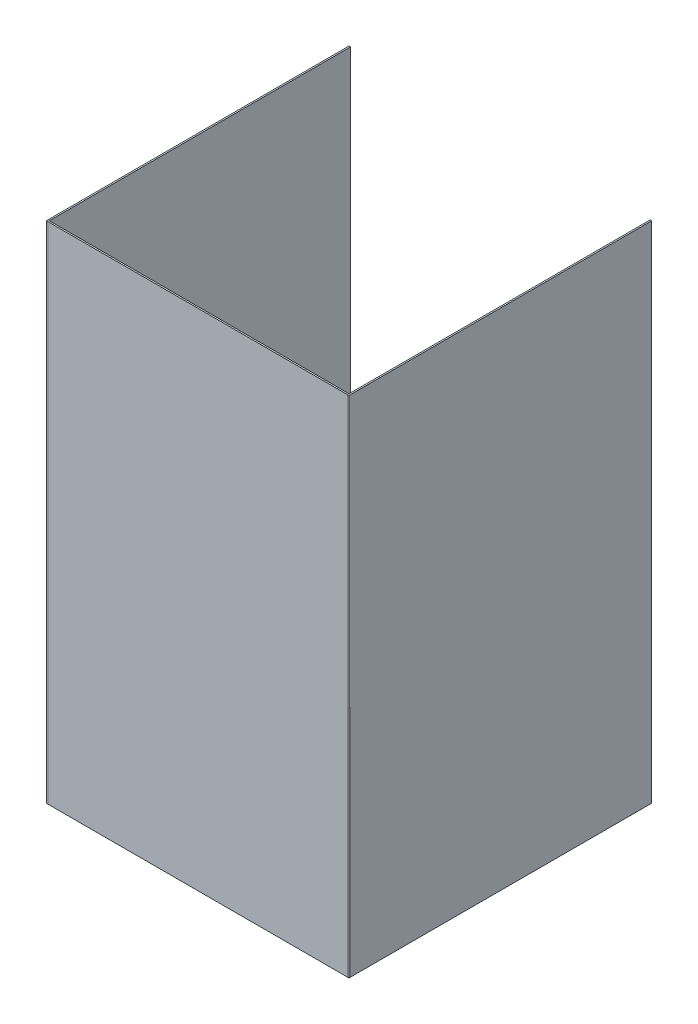
ISO-10303-21;
HEADER;
FILE_DESCRIPTION(('STEP AP214'),'2;1');
FILE_NAME('part.step','',(''),(''),'','','');
FILE_SCHEMA(('AUTOMOTIVE_DESIGN { 1 0 10303 214 1 1 1 1 }'));
ENDSEC;
DATA;
#1=APPLICATION_CONTEXT('core data for automotive mechanical design processes');
#2=APPLICATION_PROTOCOL_DEFINITION('international standard','automotive_design',2000,#1);
#3=PRODUCT_CONTEXT('',#1,'mechanical');
#4=PRODUCT('Part','Part','',(#3));
#5=PRODUCT_RELATED_PRODUCT_CATEGORY('part','',(#4));
#6=PRODUCT_DEFINITION_FORMATION('','',#4);
#7=PRODUCT_DEFINITION_CONTEXT('part definition',#1,'design');
#8=PRODUCT_DEFINITION('design','',#6,#7);
#9=PRODUCT_DEFINITION_SHAPE('','',#8);
#10=(LENGTH_UNIT() NAMED_UNIT(*) SI_UNIT(.MILLI.,.METRE.));
#11=(NAMED_UNIT(*) PLANE_ANGLE_UNIT() SI_UNIT($,.RADIAN.));
#12=(NAMED_UNIT(*) SI_UNIT($,.STERADIAN.) SOLID_ANGLE_UNIT());
#13=UNCERTAINTY_MEASURE_WITH_UNIT(LENGTH_MEASURE(1.E-05),#10,'distance_accuracy_value','');
#14=(GEOMETRIC_REPRESENTATION_CONTEXT(3) GLOBAL_UNCERTAINTY_ASSIGNED_CONTEXT((#13)) GLOBAL_UNIT_ASSIGNED_CONTEXT((#10,
#11,#12)) REPRESENTATION_CONTEXT('',''));
#15=CARTESIAN_POINT('',(0.,0.,0.));
#16=DIRECTION('',(0.,0.,1.));
#17=DIRECTION('',(1.,0.,0.));
#18=AXIS2_PLACEMENT_3D('',#15,#16,#17);
#19=CARTESIAN_POINT('',(-150.,-248.5,0.));
#20=DIRECTION('',(-1.,0.,0.));
#21=DIRECTION('',(0.,-1.,0.));
#22=AXIS2_PLACEMENT_3D('',#19,#20,#21);
#23=PLANE('',#22);
#24=DIRECTION('',(0.,0.,-1.));
#25=VECTOR('',#24,1.);
#26=CARTESIAN_POINT('',(-150.,-250.,0.));
#27=LINE('',#26,#25);
#28=CARTESIAN_POINT('',(-150.,-250.,0.));
#29=VERTEX_POINT('',#28);
#30=CARTESIAN_POINT('',(-150.,-250.,-300.));
#31=VERTEX_POINT('',#30);
#32=EDGE_CURVE('E118',#29,#31,#27,.T.);
#33=ORIENTED_EDGE('',*,*,#32,.F.);
#34=DIRECTION('',(0.,-1.,0.));
#35=VECTOR('',#34,1.);
#36=CARTESIAN_POINT('',(-150.,-248.5,0.));
#37=LINE('',#36,#35);
#38=CARTESIAN_POINT('',(-150.,-248.5,0.));
#39=VERTEX_POINT('',#38);
#40=EDGE_CURVE('E12',#39,#29,#37,.T.);
#41=ORIENTED_EDGE('',*,*,#40,.F.);
#42=DIRECTION('',(0.,0.,-1.));
#43=VECTOR('',#42,1.);
#44=CARTESIAN_POINT('',(-150.,-248.5,0.));
#45=LINE('',#44,#43);
#46=CARTESIAN_POINT('',(-150.,-248.5,-300.));
#47=VERTEX_POINT('',#46);
#48=EDGE_CURVE('E112',#39,#47,#45,.T.);
#49=ORIENTED_EDGE('',*,*,#48,.T.);
#50=DIRECTION('',(0.,-1.,0.));
#51=VECTOR('',#50,1.);
#52=CARTESIAN_POINT('',(-150.,-248.5,-300.));
#53=LINE('',#52,#51);
#54=EDGE_CURVE('E57',#47,#31,#53,.T.);
#55=ORIENTED_EDGE('',*,*,#54,.T.);
#56=EDGE_LOOP('',(#33,#41,#49,#55));
#57=FACE_BOUND('',#56,.T.);
#58=ADVANCED_FACE('F54',(#57),#23,.T.);
#59=CARTESIAN_POINT('',(-150.,-248.5,0.));
#60=DIRECTION('',(0.,0.,1.));
#61=DIRECTION('',(1.,0.,0.));
#62=AXIS2_PLACEMENT_3D('',#59,#60,#61);
#63=PLANE('',#62);
#64=DIRECTION('',(-1.,0.,0.));
#65=VECTOR('',#64,1.);
#66=CARTESIAN_POINT('',(-150.,-250.,0.));
#67=LINE('',#66,#65);
#68=CARTESIAN_POINT('',(150.,-250.,0.));
#69=VERTEX_POINT('',#68);
#70=EDGE_CURVE('E114',#69,#29,#67,.T.);
#71=ORIENTED_EDGE('',*,*,#70,.F.);
#72=DIRECTION('',(0.,-1.,0.));
#73=VECTOR('',#72,1.);
#74=CARTESIAN_POINT('',(150.,-248.5,0.));
#75=LINE('',#74,#73);
#76=CARTESIAN_POINT('',(150.,-248.5,0.));
#77=VERTEX_POINT('',#76);
#78=EDGE_CURVE('E63',#77,#69,#75,.T.);
#79=ORIENTED_EDGE('',*,*,#78,.F.);
#80=DIRECTION('',(-1.,0.,0.));
#81=VECTOR('',#80,1.);
#82=CARTESIAN_POINT('',(-150.,-248.5,0.));
#83=LINE('',#82,#81);
#84=EDGE_CURVE('E109',#77,#39,#83,.T.);
#85=ORIENTED_EDGE('',*,*,#84,.T.);
#86=ORIENTED_EDGE('',*,*,#40,.T.);
#87=EDGE_LOOP('',(#71,#79,#85,#86));
#88=FACE_BOUND('',#87,.T.);
#89=ADVANCED_FACE('F128',(#88),#63,.T.);
#90=CARTESIAN_POINT('',(150.,-248.5,0.));
#91=DIRECTION('',(1.,0.,0.));
#92=DIRECTION('',(0.,1.,0.));
#93=AXIS2_PLACEMENT_3D('',#90,#91,#92);
#94=PLANE('',#93);
#95=DIRECTION('',(0.,0.,1.));
#96=VECTOR('',#95,1.);
#97=CARTESIAN_POINT('',(150.,-250.,0.));
#98=LINE('',#97,#96);
#99=CARTESIAN_POINT('',(150.,-250.,-300.));
#100=VERTEX_POINT('',#99);
#101=EDGE_CURVE('E104',#100,#69,#98,.T.);
#102=ORIENTED_EDGE('',*,*,#101,.F.);
#103=DIRECTION('',(0.,-1.,0.));
#104=VECTOR('',#103,1.);
#105=CARTESIAN_POINT('',(150.,-248.5,-300.));
#106=LINE('',#105,#104);
#107=CARTESIAN_POINT('',(150.,-248.5,-300.));
#108=VERTEX_POINT('',#107);
#109=EDGE_CURVE('E99',#108,#100,#106,.T.);
#110=ORIENTED_EDGE('',*,*,#109,.F.);
#111=DIRECTION('',(0.,0.,1.));
#112=VECTOR('',#111,1.);
#113=CARTESIAN_POINT('',(150.,-248.5,0.));
#114=LINE('',#113,#112);
#115=EDGE_CURVE('E102',#108,#77,#114,.T.);
#116=ORIENTED_EDGE('',*,*,#115,.T.);
#117=ORIENTED_EDGE('',*,*,#78,.T.);
#118=EDGE_LOOP('',(#102,#110,#116,#117));
#119=FACE_BOUND('',#118,.T.);
#120=ADVANCED_FACE('F101',(#119),#94,.T.);
#121=CARTESIAN_POINT('',(-150.,-248.5,-300.));
#122=DIRECTION('',(0.,0.,-1.));
#123=DIRECTION('',(-1.,0.,0.));
#124=AXIS2_PLACEMENT_3D('',#121,#122,#123);
#125=PLANE('',#124);
#126=DIRECTION('',(1.,0.,0.));
#127=VECTOR('',#126,1.);
#128=CARTESIAN_POINT('',(-150.,-250.,-300.));
#129=LINE('',#128,#127);
#130=EDGE_CURVE('E121',#31,#100,#129,.T.);
#131=ORIENTED_EDGE('',*,*,#130,.F.);
#132=ORIENTED_EDGE('',*,*,#54,.F.);
#133=DIRECTION('',(1.,0.,0.));
#134=VECTOR('',#133,1.);
#135=CARTESIAN_POINT('',(-150.,-248.5,-300.));
#136=LINE('',#135,#134);
#137=EDGE_CURVE('E108',#47,#108,#136,.T.);
#138=ORIENTED_EDGE('',*,*,#137,.T.);
#139=ORIENTED_EDGE('',*,*,#109,.T.);
#140=EDGE_LOOP('',(#131,#132,#138,#139));
#141=FACE_BOUND('',#140,.T.);
#142=ADVANCED_FACE('F111',(#141),#125,.T.);
#143=CARTESIAN_POINT('',(0.,-248.5,0.));
#144=DIRECTION('',(0.,-1.,0.));
#145=DIRECTION('',(1.,0.,0.));
#146=AXIS2_PLACEMENT_3D('',#143,#144,#145);
#147=PLANE('',#146);
#148=ORIENTED_EDGE('',*,*,#48,.F.);
#149=ORIENTED_EDGE('',*,*,#84,.F.);
#150=ORIENTED_EDGE('',*,*,#115,.F.);
#151=ORIENTED_EDGE('',*,*,#137,.F.);
#152=EDGE_LOOP('',(#148,#149,#150,#151));
#153=FACE_BOUND('',#152,.T.);
#154=ADVANCED_FACE('F107',(#153),#147,.F.);
#155=CARTESIAN_POINT('',(0.,-250.,0.));
#156=DIRECTION('',(0.,-1.,0.));
#157=DIRECTION('',(1.,0.,0.));
#158=AXIS2_PLACEMENT_3D('',#155,#156,#157);
#159=PLANE('',#158);
#160=ORIENTED_EDGE('',*,*,#32,.T.);
#161=ORIENTED_EDGE('',*,*,#130,.T.);
#162=ORIENTED_EDGE('',*,*,#101,.T.);
#163=ORIENTED_EDGE('',*,*,#70,.T.);
#164=EDGE_LOOP('',(#160,#161,#162,#163));
#165=FACE_BOUND('',#164,.T.);
#166=ADVANCED_FACE('F127',(#165),#159,.T.);
#167=CLOSED_SHELL('',(#58,#89,#120,#142,#154,#166));
#168=MANIFOLD_SOLID_BREP('B2',#167);
#169=CARTESIAN_POINT('',(-148.5,250.,0.));
#170=DIRECTION('',(0.,0.,1.));
#171=DIRECTION('',(0.,-1.,0.));
#172=AXIS2_PLACEMENT_3D('',#169,#170,#171);
#173=PLANE('',#172);
#174=DIRECTION('',(0.,1.,0.));
#175=VECTOR('',#174,1.);
#176=CARTESIAN_POINT('',(-150.,250.,0.));
#177=LINE('',#176,#175);
#178=CARTESIAN_POINT('',(-150.,-250.,0.));
#179=VERTEX_POINT('',#178);
#180=CARTESIAN_POINT('',(-150.,250.,0.));
#181=VERTEX_POINT('',#180);
#182=EDGE_CURVE('E264',#179,#181,#177,.T.);
#183=ORIENTED_EDGE('',*,*,#182,.F.);
#184=DIRECTION('',(-1.,0.,0.));
#185=VECTOR('',#184,1.);
#186=CARTESIAN_POINT('',(-148.5,-250.,0.));
#187=LINE('',#186,#185);
#188=CARTESIAN_POINT('',(-148.5,-250.,0.));
#189=VERTEX_POINT('',#188);
#190=EDGE_CURVE('E52',#189,#179,#187,.T.);
#191=ORIENTED_EDGE('',*,*,#190,.F.);
#192=DIRECTION('',(0.,1.,0.));
#193=VECTOR('',#192,1.);
#194=CARTESIAN_POINT('',(-148.5,250.,0.));
#195=LINE('',#194,#193);
#196=CARTESIAN_POINT('',(-148.5,250.,0.));
#197=VERTEX_POINT('',#196);
#198=EDGE_CURVE('E258',#189,#197,#195,.T.);
#199=ORIENTED_EDGE('',*,*,#198,.T.);
#200=DIRECTION('',(-1.,0.,0.));
#201=VECTOR('',#200,1.);
#202=CARTESIAN_POINT('',(-148.5,250.,0.));
#203=LINE('',#202,#201);
#204=EDGE_CURVE('E203',#197,#181,#203,.T.);
#205=ORIENTED_EDGE('',*,*,#204,.T.);
#206=EDGE_LOOP('',(#183,#191,#199,#205));
#207=FACE_BOUND('',#206,.T.);
#208=ADVANCED_FACE('F200',(#207),#173,.T.);
#209=CARTESIAN_POINT('',(-148.5,-250.,0.));
#210=DIRECTION('',(0.,-1.,0.));
#211=DIRECTION('',(0.,0.,-1.));
#212=AXIS2_PLACEMENT_3D('',#209,#210,#211);
#213=PLANE('',#212);
#214=DIRECTION('',(0.,0.,1.));
#215=VECTOR('',#214,1.);
#216=CARTESIAN_POINT('',(-150.,-250.,0.));
#217=LINE('',#216,#215);
#218=CARTESIAN_POINT('',(-150.,-250.,-300.));
#219=VERTEX_POINT('',#218);
#220=EDGE_CURVE('E260',#219,#179,#217,.T.);
#221=ORIENTED_EDGE('',*,*,#220,.F.);
#222=DIRECTION('',(-1.,0.,0.));
#223=VECTOR('',#222,1.);
#224=CARTESIAN_POINT('',(-148.5,-250.,-300.));
#225=LINE('',#224,#223);
#226=CARTESIAN_POINT('',(-148.5,-250.,-300.));
#227=VERTEX_POINT('',#226);
#228=EDGE_CURVE('E209',#227,#219,#225,.T.);
#229=ORIENTED_EDGE('',*,*,#228,.F.);
#230=DIRECTION('',(0.,0.,1.));
#231=VECTOR('',#230,1.);
#232=CARTESIAN_POINT('',(-148.5,-250.,0.));
#233=LINE('',#232,#231);
#234=EDGE_CURVE('E255',#227,#189,#233,.T.);
#235=ORIENTED_EDGE('',*,*,#234,.T.);
#236=ORIENTED_EDGE('',*,*,#190,.T.);
#237=EDGE_LOOP('',(#221,#229,#235,#236));
#238=FACE_BOUND('',#237,.T.);
#239=ADVANCED_FACE('F274',(#238),#213,.T.);
#240=CARTESIAN_POINT('',(-148.5,250.,-300.));
#241=DIRECTION('',(0.,0.,-1.));
#242=DIRECTION('',(0.,1.,0.));
#243=AXIS2_PLACEMENT_3D('',#240,#241,#242);
#244=PLANE('',#243);
#245=DIRECTION('',(0.,-1.,0.));
#246=VECTOR('',#245,1.);
#247=CARTESIAN_POINT('',(-150.,250.,-300.));
#248=LINE('',#247,#246);
#249=CARTESIAN_POINT('',(-150.,250.,-300.));
#250=VERTEX_POINT('',#249);
#251=EDGE_CURVE('E250',#250,#219,#248,.T.);
#252=ORIENTED_EDGE('',*,*,#251,.F.);
#253=DIRECTION('',(-1.,0.,0.));
#254=VECTOR('',#253,1.);
#255=CARTESIAN_POINT('',(-148.5,250.,-300.));
#256=LINE('',#255,#254);
#257=CARTESIAN_POINT('',(-148.5,250.,-300.));
#258=VERTEX_POINT('',#257);
#259=EDGE_CURVE('E245',#258,#250,#256,.T.);
#260=ORIENTED_EDGE('',*,*,#259,.F.);
#261=DIRECTION('',(0.,-1.,0.));
#262=VECTOR('',#261,1.);
#263=CARTESIAN_POINT('',(-148.5,250.,-300.));
#264=LINE('',#263,#262);
#265=EDGE_CURVE('E248',#258,#227,#264,.T.);
#266=ORIENTED_EDGE('',*,*,#265,.T.);
#267=ORIENTED_EDGE('',*,*,#228,.T.);
#268=EDGE_LOOP('',(#252,#260,#266,#267));
#269=FACE_BOUND('',#268,.T.);
#270=ADVANCED_FACE('F247',(#269),#244,.T.);
#271=CARTESIAN_POINT('',(-148.5,250.,0.));
#272=DIRECTION('',(0.,1.,0.));
#273=DIRECTION('',(-1.,0.,0.));
#274=AXIS2_PLACEMENT_3D('',#271,#272,#273);
#275=PLANE('',#274);
#276=DIRECTION('',(0.,0.,-1.));
#277=VECTOR('',#276,1.);
#278=CARTESIAN_POINT('',(-150.,250.,0.));
#279=LINE('',#278,#277);
#280=EDGE_CURVE('E267',#181,#250,#279,.T.);
#281=ORIENTED_EDGE('',*,*,#280,.F.);
#282=ORIENTED_EDGE('',*,*,#204,.F.);
#283=DIRECTION('',(0.,0.,-1.));
#284=VECTOR('',#283,1.);
#285=CARTESIAN_POINT('',(-148.5,250.,0.));
#286=LINE('',#285,#284);
#287=EDGE_CURVE('E254',#197,#258,#286,.T.);
#288=ORIENTED_EDGE('',*,*,#287,.T.);
#289=ORIENTED_EDGE('',*,*,#259,.T.);
#290=EDGE_LOOP('',(#281,#282,#288,#289));
#291=FACE_BOUND('',#290,.T.);
#292=ADVANCED_FACE('F257',(#291),#275,.T.);
#293=CARTESIAN_POINT('',(-148.5,0.,0.));
#294=DIRECTION('',(1.,0.,0.));
#295=DIRECTION('',(0.,1.,0.));
#296=AXIS2_PLACEMENT_3D('',#293,#294,#295);
#297=PLANE('',#296);
#298=ORIENTED_EDGE('',*,*,#198,.F.);
#299=ORIENTED_EDGE('',*,*,#234,.F.);
#300=ORIENTED_EDGE('',*,*,#265,.F.);
#301=ORIENTED_EDGE('',*,*,#287,.F.);
#302=EDGE_LOOP('',(#298,#299,#300,#301));
#303=FACE_BOUND('',#302,.T.);
#304=ADVANCED_FACE('F253',(#303),#297,.T.);
#305=CARTESIAN_POINT('',(-150.,0.,0.));
#306=DIRECTION('',(1.,0.,0.));
#307=DIRECTION('',(0.,1.,0.));
#308=AXIS2_PLACEMENT_3D('',#305,#306,#307);
#309=PLANE('',#308);
#310=ORIENTED_EDGE('',*,*,#182,.T.);
#311=ORIENTED_EDGE('',*,*,#280,.T.);
#312=ORIENTED_EDGE('',*,*,#251,.T.);
#313=ORIENTED_EDGE('',*,*,#220,.T.);
#314=EDGE_LOOP('',(#310,#311,#312,#313));
#315=FACE_BOUND('',#314,.T.);
#316=ADVANCED_FACE('F273',(#315),#309,.F.);
#317=CLOSED_SHELL('',(#208,#239,#270,#292,#304,#316));
#318=MANIFOLD_SOLID_BREP('B6',#317);
#319=CARTESIAN_POINT('',(148.5,250.,0.));
#320=DIRECTION('',(0.,0.,1.));
#321=DIRECTION('',(1.,0.,0.));
#322=AXIS2_PLACEMENT_3D('',#319,#320,#321);
#323=PLANE('',#322);
#324=DIRECTION('',(0.,-1.,0.));
#325=VECTOR('',#324,1.);
#326=CARTESIAN_POINT('',(150.,250.,0.));
#327=LINE('',#326,#325);
#328=CARTESIAN_POINT('',(150.,250.,0.));
#329=VERTEX_POINT('',#328);
#330=CARTESIAN_POINT('',(150.,-250.,0.));
#331=VERTEX_POINT('',#330);
#332=EDGE_CURVE('E416',#329,#331,#327,.T.);
#333=ORIENTED_EDGE('',*,*,#332,.F.);
#334=DIRECTION('',(1.,0.,0.));
#335=VECTOR('',#334,1.);
#336=CARTESIAN_POINT('',(148.5,250.,0.));
#337=LINE('',#336,#335);
#338=CARTESIAN_POINT('',(148.5,250.,0.));
#339=VERTEX_POINT('',#338);
#340=EDGE_CURVE('E198',#339,#329,#337,.T.);
#341=ORIENTED_EDGE('',*,*,#340,.F.);
#342=DIRECTION('',(0.,-1.,0.));
#343=VECTOR('',#342,1.);
#344=CARTESIAN_POINT('',(148.5,250.,0.));
#345=LINE('',#344,#343);
#346=CARTESIAN_POINT('',(148.5,-250.,0.));
#347=VERTEX_POINT('',#346);
#348=EDGE_CURVE('E409',#339,#347,#345,.T.);
#349=ORIENTED_EDGE('',*,*,#348,.T.);
#350=DIRECTION('',(1.,0.,0.));
#351=VECTOR('',#350,1.);
#352=CARTESIAN_POINT('',(148.5,-250.,0.));
#353=LINE('',#352,#351);
#354=EDGE_CURVE('E348',#347,#331,#353,.T.);
#355=ORIENTED_EDGE('',*,*,#354,.T.);
#356=EDGE_LOOP('',(#333,#341,#349,#355));
#357=FACE_BOUND('',#356,.T.);
#358=ADVANCED_FACE('F345',(#357),#323,.T.);
#359=CARTESIAN_POINT('',(148.5,250.,0.));
#360=DIRECTION('',(0.,-1.,0.));
#361=DIRECTION('',(1.,0.,0.));
#362=AXIS2_PLACEMENT_3D('',#359,#360,#361);
#363=PLANE('',#362);
#364=DIRECTION('',(0.,0.,-1.));
#365=VECTOR('',#364,1.);
#366=CARTESIAN_POINT('',(150.,250.,0.));
#367=LINE('',#366,#365);
#368=CARTESIAN_POINT('',(150.,250.,-300.));
#369=VERTEX_POINT('',#368);
#370=EDGE_CURVE('E379',#329,#369,#367,.T.);
#371=ORIENTED_EDGE('',*,*,#370,.T.);
#372=DIRECTION('',(1.,0.,0.));
#373=VECTOR('',#372,1.);
#374=CARTESIAN_POINT('',(148.5,250.,-300.));
#375=LINE('',#374,#373);
#376=CARTESIAN_POINT('',(148.5,250.,-300.));
#377=VERTEX_POINT('',#376);
#378=EDGE_CURVE('E355',#377,#369,#375,.T.);
#379=ORIENTED_EDGE('',*,*,#378,.F.);
#380=DIRECTION('',(0.,0.,-1.));
#381=VECTOR('',#380,1.);
#382=CARTESIAN_POINT('',(148.5,250.,0.));
#383=LINE('',#382,#381);
#384=EDGE_CURVE('E396',#339,#377,#383,.T.);
#385=ORIENTED_EDGE('',*,*,#384,.F.);
#386=ORIENTED_EDGE('',*,*,#340,.T.);
#387=EDGE_LOOP('',(#371,#379,#385,#386));
#388=FACE_BOUND('',#387,.T.);
#389=ADVANCED_FACE('F432',(#388),#363,.F.);
#390=CARTESIAN_POINT('',(148.5,250.,-300.));
#391=DIRECTION('',(0.,0.,1.));
#392=DIRECTION('',(1.,0.,0.));
#393=AXIS2_PLACEMENT_3D('',#390,#391,#392);
#394=PLANE('',#393);
#395=DIRECTION('',(0.,-1.,0.));
#396=VECTOR('',#395,1.);
#397=CARTESIAN_POINT('',(150.,250.,-300.));
#398=LINE('',#397,#396);
#399=CARTESIAN_POINT('',(150.,-250.,-300.));
#400=VERTEX_POINT('',#399);
#401=EDGE_CURVE('E404',#369,#400,#398,.T.);
#402=ORIENTED_EDGE('',*,*,#401,.T.);
#403=DIRECTION('',(1.,0.,0.));
#404=VECTOR('',#403,1.);
#405=CARTESIAN_POINT('',(148.5,-250.,-300.));
#406=LINE('',#405,#404);
#407=CARTESIAN_POINT('',(148.5,-250.,-300.));
#408=VERTEX_POINT('',#407);
#409=EDGE_CURVE('E401',#408,#400,#406,.T.);
#410=ORIENTED_EDGE('',*,*,#409,.F.);
#411=DIRECTION('',(0.,-1.,0.));
#412=VECTOR('',#411,1.);
#413=CARTESIAN_POINT('',(148.5,250.,-300.));
#414=LINE('',#413,#412);
#415=EDGE_CURVE('E391',#377,#408,#414,.T.);
#416=ORIENTED_EDGE('',*,*,#415,.F.);
#417=ORIENTED_EDGE('',*,*,#378,.T.);
#418=EDGE_LOOP('',(#402,#410,#416,#417));
#419=FACE_BOUND('',#418,.T.);
#420=ADVANCED_FACE('F402',(#419),#394,.F.);
#421=CARTESIAN_POINT('',(148.5,-250.,0.));
#422=DIRECTION('',(0.,-1.,0.));
#423=DIRECTION('',(1.,0.,0.));
#424=AXIS2_PLACEMENT_3D('',#421,#422,#423);
#425=PLANE('',#424);
#426=DIRECTION('',(0.,0.,-1.));
#427=VECTOR('',#426,1.);
#428=CARTESIAN_POINT('',(150.,-250.,0.));
#429=LINE('',#428,#427);
#430=EDGE_CURVE('E420',#331,#400,#429,.T.);
#431=ORIENTED_EDGE('',*,*,#430,.F.);
#432=ORIENTED_EDGE('',*,*,#354,.F.);
#433=DIRECTION('',(0.,0.,-1.));
#434=VECTOR('',#433,1.);
#435=CARTESIAN_POINT('',(148.5,-250.,0.));
#436=LINE('',#435,#434);
#437=EDGE_CURVE('E395',#347,#408,#436,.T.);
#438=ORIENTED_EDGE('',*,*,#437,.T.);
#439=ORIENTED_EDGE('',*,*,#409,.T.);
#440=EDGE_LOOP('',(#431,#432,#438,#439));
#441=FACE_BOUND('',#440,.T.);
#442=ADVANCED_FACE('F407',(#441),#425,.T.);
#443=CARTESIAN_POINT('',(148.5,0.,0.));
#444=DIRECTION('',(1.,0.,0.));
#445=DIRECTION('',(0.,1.,0.));
#446=AXIS2_PLACEMENT_3D('',#443,#444,#445);
#447=PLANE('',#446);
#448=ORIENTED_EDGE('',*,*,#348,.F.);
#449=ORIENTED_EDGE('',*,*,#384,.T.);
#450=ORIENTED_EDGE('',*,*,#415,.T.);
#451=ORIENTED_EDGE('',*,*,#437,.F.);
#452=EDGE_LOOP('',(#448,#449,#450,#451));
#453=FACE_BOUND('',#452,.T.);
#454=ADVANCED_FACE('F394',(#453),#447,.F.);
#455=CARTESIAN_POINT('',(150.,0.,0.));
#456=DIRECTION('',(1.,0.,0.));
#457=DIRECTION('',(0.,1.,0.));
#458=AXIS2_PLACEMENT_3D('',#455,#456,#457);
#459=PLANE('',#458);
#460=ORIENTED_EDGE('',*,*,#332,.T.);
#461=ORIENTED_EDGE('',*,*,#430,.T.);
#462=ORIENTED_EDGE('',*,*,#401,.F.);
#463=ORIENTED_EDGE('',*,*,#370,.F.);
#464=EDGE_LOOP('',(#460,#461,#462,#463));
#465=FACE_BOUND('',#464,.T.);
#466=ADVANCED_FACE('F429',(#465),#459,.T.);
#467=CLOSED_SHELL('',(#358,#389,#420,#442,#454,#466));
#468=MANIFOLD_SOLID_BREP('B46',#467);
#469=CARTESIAN_POINT('',(150.,250.,-1.5));
#470=DIRECTION('',(1.,0.,0.));
#471=DIRECTION('',(0.,1.,0.));
#472=AXIS2_PLACEMENT_3D('',#469,#470,#471);
#473=PLANE('',#472);
#474=DIRECTION('',(0.,1.,0.));
#475=VECTOR('',#474,1.);
#476=CARTESIAN_POINT('',(150.,250.,0.));
#477=LINE('',#476,#475);
#478=CARTESIAN_POINT('',(150.,-250.,0.));
#479=VERTEX_POINT('',#478);
#480=CARTESIAN_POINT('',(150.,250.,0.));
#481=VERTEX_POINT('',#480);
#482=EDGE_CURVE('E557',#479,#481,#477,.T.);
#483=ORIENTED_EDGE('',*,*,#482,.F.);
#484=DIRECTION('',(0.,0.,1.));
#485=VECTOR('',#484,1.);
#486=CARTESIAN_POINT('',(150.,-250.,-1.5));
#487=LINE('',#486,#485);
#488=CARTESIAN_POINT('',(150.,-250.,-1.5));
#489=VERTEX_POINT('',#488);
#490=EDGE_CURVE('E343',#489,#479,#487,.T.);
#491=ORIENTED_EDGE('',*,*,#490,.F.);
#492=DIRECTION('',(0.,1.,0.));
#493=VECTOR('',#492,1.);
#494=CARTESIAN_POINT('',(150.,250.,-1.5));
#495=LINE('',#494,#493);
#496=CARTESIAN_POINT('',(150.,250.,-1.5));
#497=VERTEX_POINT('',#496);
#498=EDGE_CURVE('E551',#489,#497,#495,.T.);
#499=ORIENTED_EDGE('',*,*,#498,.T.);
#500=DIRECTION('',(0.,0.,1.));
#501=VECTOR('',#500,1.);
#502=CARTESIAN_POINT('',(150.,250.,-1.5));
#503=LINE('',#502,#501);
#504=EDGE_CURVE('E496',#497,#481,#503,.T.);
#505=ORIENTED_EDGE('',*,*,#504,.T.);
#506=EDGE_LOOP('',(#483,#491,#499,#505));
#507=FACE_BOUND('',#506,.T.);
#508=ADVANCED_FACE('F493',(#507),#473,.T.);
#509=CARTESIAN_POINT('',(-150.,-250.,-1.5));
#510=DIRECTION('',(0.,-1.,0.));
#511=DIRECTION('',(0.,0.,-1.));
#512=AXIS2_PLACEMENT_3D('',#509,#510,#511);
#513=PLANE('',#512);
#514=DIRECTION('',(1.,0.,0.));
#515=VECTOR('',#514,1.);
#516=CARTESIAN_POINT('',(-150.,-250.,0.));
#517=LINE('',#516,#515);
#518=CARTESIAN_POINT('',(-150.,-250.,0.));
#519=VERTEX_POINT('',#518);
#520=EDGE_CURVE('E553',#519,#479,#517,.T.);
#521=ORIENTED_EDGE('',*,*,#520,.F.);
#522=DIRECTION('',(0.,0.,1.));
#523=VECTOR('',#522,1.);
#524=CARTESIAN_POINT('',(-150.,-250.,-1.5));
#525=LINE('',#524,#523);
#526=CARTESIAN_POINT('',(-150.,-250.,-1.5));
#527=VERTEX_POINT('',#526);
#528=EDGE_CURVE('E502',#527,#519,#525,.T.);
#529=ORIENTED_EDGE('',*,*,#528,.F.);
#530=DIRECTION('',(1.,0.,0.));
#531=VECTOR('',#530,1.);
#532=CARTESIAN_POINT('',(-150.,-250.,-1.5));
#533=LINE('',#532,#531);
#534=EDGE_CURVE('E548',#527,#489,#533,.T.);
#535=ORIENTED_EDGE('',*,*,#534,.T.);
#536=ORIENTED_EDGE('',*,*,#490,.T.);
#537=EDGE_LOOP('',(#521,#529,#535,#536));
#538=FACE_BOUND('',#537,.T.);
#539=ADVANCED_FACE('F567',(#538),#513,.T.);
#540=CARTESIAN_POINT('',(-150.,250.,-1.5));
#541=DIRECTION('',(-1.,0.,0.));
#542=DIRECTION('',(0.,-1.,0.));
#543=AXIS2_PLACEMENT_3D('',#540,#541,#542);
#544=PLANE('',#543);
#545=DIRECTION('',(0.,-1.,0.));
#546=VECTOR('',#545,1.);
#547=CARTESIAN_POINT('',(-150.,250.,0.));
#548=LINE('',#547,#546);
#549=CARTESIAN_POINT('',(-150.,250.,0.));
#550=VERTEX_POINT('',#549);
#551=EDGE_CURVE('E543',#550,#519,#548,.T.);
#552=ORIENTED_EDGE('',*,*,#551,.F.);
#553=DIRECTION('',(0.,0.,1.));
#554=VECTOR('',#553,1.);
#555=CARTESIAN_POINT('',(-150.,250.,-1.5));
#556=LINE('',#555,#554);
#557=CARTESIAN_POINT('',(-150.,250.,-1.5));
#558=VERTEX_POINT('',#557);
#559=EDGE_CURVE('E538',#558,#550,#556,.T.);
#560=ORIENTED_EDGE('',*,*,#559,.F.);
#561=DIRECTION('',(0.,-1.,0.));
#562=VECTOR('',#561,1.);
#563=CARTESIAN_POINT('',(-150.,250.,-1.5));
#564=LINE('',#563,#562);
#565=EDGE_CURVE('E541',#558,#527,#564,.T.);
#566=ORIENTED_EDGE('',*,*,#565,.T.);
#567=ORIENTED_EDGE('',*,*,#528,.T.);
#568=EDGE_LOOP('',(#552,#560,#566,#567));
#569=FACE_BOUND('',#568,.T.);
#570=ADVANCED_FACE('F540',(#569),#544,.T.);
#571=CARTESIAN_POINT('',(-150.,250.,-1.5));
#572=DIRECTION('',(0.,1.,0.));
#573=DIRECTION('',(0.,0.,1.));
#574=AXIS2_PLACEMENT_3D('',#571,#572,#573);
#575=PLANE('',#574);
#576=DIRECTION('',(-1.,0.,0.));
#577=VECTOR('',#576,1.);
#578=CARTESIAN_POINT('',(-150.,250.,0.));
#579=LINE('',#578,#577);
#580=EDGE_CURVE('E560',#481,#550,#579,.T.);
#581=ORIENTED_EDGE('',*,*,#580,.F.);
#582=ORIENTED_EDGE('',*,*,#504,.F.);
#583=DIRECTION('',(-1.,0.,0.));
#584=VECTOR('',#583,1.);
#585=CARTESIAN_POINT('',(-150.,250.,-1.5));
#586=LINE('',#585,#584);
#587=EDGE_CURVE('E547',#497,#558,#586,.T.);
#588=ORIENTED_EDGE('',*,*,#587,.T.);
#589=ORIENTED_EDGE('',*,*,#559,.T.);
#590=EDGE_LOOP('',(#581,#582,#588,#589));
#591=FACE_BOUND('',#590,.T.);
#592=ADVANCED_FACE('F550',(#591),#575,.T.);
#593=CARTESIAN_POINT('',(0.,0.,-1.5));
#594=DIRECTION('',(0.,0.,1.));
#595=DIRECTION('',(1.,0.,0.));
#596=AXIS2_PLACEMENT_3D('',#593,#594,#595);
#597=PLANE('',#596);
#598=ORIENTED_EDGE('',*,*,#498,.F.);
#599=ORIENTED_EDGE('',*,*,#534,.F.);
#600=ORIENTED_EDGE('',*,*,#565,.F.);
#601=ORIENTED_EDGE('',*,*,#587,.F.);
#602=EDGE_LOOP('',(#598,#599,#600,#601));
#603=FACE_BOUND('',#602,.T.);
#604=ADVANCED_FACE('F546',(#603),#597,.F.);
#605=CARTESIAN_POINT('',(0.,0.,0.));
#606=DIRECTION('',(0.,0.,1.));
#607=DIRECTION('',(1.,0.,0.));
#608=AXIS2_PLACEMENT_3D('',#605,#606,#607);
#609=PLANE('',#608);
#610=ORIENTED_EDGE('',*,*,#482,.T.);
#611=ORIENTED_EDGE('',*,*,#580,.T.);
#612=ORIENTED_EDGE('',*,*,#551,.T.);
#613=ORIENTED_EDGE('',*,*,#520,.T.);
#614=EDGE_LOOP('',(#610,#611,#612,#613));
#615=FACE_BOUND('',#614,.T.);
#616=ADVANCED_FACE('F566',(#615),#609,.T.);
#617=CLOSED_SHELL('',(#508,#539,#570,#592,#604,#616));
#618=MANIFOLD_SOLID_BREP('B192',#617);
#619=ADVANCED_BREP_SHAPE_REPRESENTATION('',(#18,#168,#318,#468,#618),#14);
#620=SHAPE_DEFINITION_REPRESENTATION(#9,#619);
ENDSEC;
END-ISO-10303-21;
